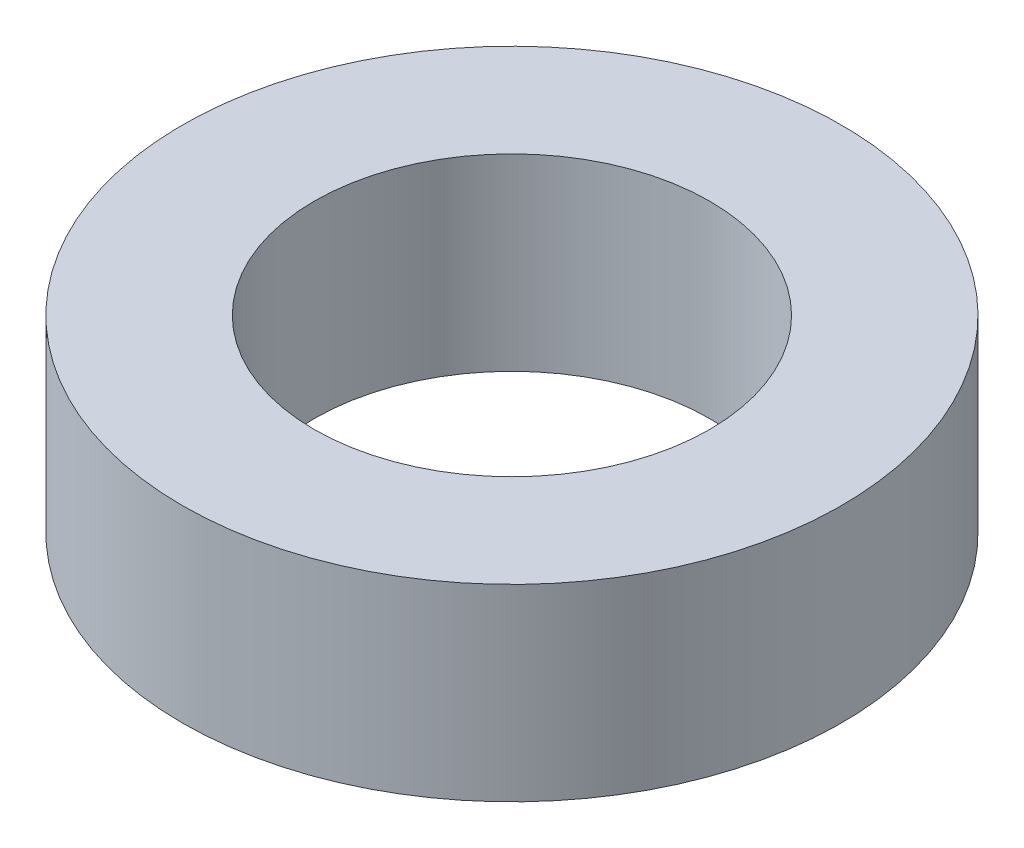
ISO-10303-21;
HEADER;
FILE_DESCRIPTION(('STEP AP214'),'2;1');
FILE_NAME('part.step','',(''),(''),'','','');
FILE_SCHEMA(('AUTOMOTIVE_DESIGN { 1 0 10303 214 1 1 1 1 }'));
ENDSEC;
DATA;
#1=APPLICATION_CONTEXT('core data for automotive mechanical design processes');
#2=APPLICATION_PROTOCOL_DEFINITION('international standard','automotive_design',2000,#1);
#3=PRODUCT_CONTEXT('',#1,'mechanical');
#4=PRODUCT('Part','Part','',(#3));
#5=PRODUCT_RELATED_PRODUCT_CATEGORY('part','',(#4));
#6=PRODUCT_DEFINITION_FORMATION('','',#4);
#7=PRODUCT_DEFINITION_CONTEXT('part definition',#1,'design');
#8=PRODUCT_DEFINITION('design','',#6,#7);
#9=PRODUCT_DEFINITION_SHAPE('','',#8);
#10=(LENGTH_UNIT() NAMED_UNIT(*) SI_UNIT(.MILLI.,.METRE.));
#11=(NAMED_UNIT(*) PLANE_ANGLE_UNIT() SI_UNIT($,.RADIAN.));
#12=(NAMED_UNIT(*) SI_UNIT($,.STERADIAN.) SOLID_ANGLE_UNIT());
#13=UNCERTAINTY_MEASURE_WITH_UNIT(LENGTH_MEASURE(1.E-05),#10,'distance_accuracy_value','');
#14=(GEOMETRIC_REPRESENTATION_CONTEXT(3) GLOBAL_UNCERTAINTY_ASSIGNED_CONTEXT((#13)) GLOBAL_UNIT_ASSIGNED_CONTEXT((#10,
#11,#12)) REPRESENTATION_CONTEXT('',''));
#15=CARTESIAN_POINT('',(0.,0.,0.));
#16=DIRECTION('',(0.,0.,1.));
#17=DIRECTION('',(1.,0.,0.));
#18=AXIS2_PLACEMENT_3D('',#15,#16,#17);
#19=CARTESIAN_POINT('',(0.,2.,0.));
#20=DIRECTION('',(0.,1.,0.));
#21=DIRECTION('',(0.,0.,1.));
#22=AXIS2_PLACEMENT_3D('',#19,#20,#21);
#23=PLANE('',#22);
#24=CARTESIAN_POINT('',(0.,2.,0.));
#25=DIRECTION('',(0.,1.,0.));
#26=DIRECTION('',(0.,0.,1.));
#27=AXIS2_PLACEMENT_3D('',#24,#25,#26);
#28=CIRCLE('',#27,3.5);
#29=CARTESIAN_POINT('',(0.,2.,3.5));
#30=VERTEX_POINT('',#29);
#31=EDGE_CURVE('E10',#30,#30,#28,.T.);
#32=ORIENTED_EDGE('',*,*,#31,.T.);
#33=EDGE_LOOP('',(#32));
#34=FACE_BOUND('',#33,.T.);
#35=CARTESIAN_POINT('',(0.,2.,0.));
#36=DIRECTION('',(0.,1.,0.));
#37=DIRECTION('',(0.,0.,1.));
#38=AXIS2_PLACEMENT_3D('',#35,#36,#37);
#39=CIRCLE('',#38,2.1);
#40=CARTESIAN_POINT('',(0.,2.,2.1));
#41=VERTEX_POINT('',#40);
#42=EDGE_CURVE('E42',#41,#41,#39,.T.);
#43=ORIENTED_EDGE('',*,*,#42,.F.);
#44=EDGE_LOOP('',(#43));
#45=FACE_BOUND('',#44,.T.);
#46=ADVANCED_FACE('F31',(#34,#45),#23,.T.);
#47=CARTESIAN_POINT('',(0.,0.,0.));
#48=DIRECTION('',(0.,1.,0.));
#49=DIRECTION('',(0.,0.,1.));
#50=AXIS2_PLACEMENT_3D('',#47,#48,#49);
#51=PLANE('',#50);
#52=CARTESIAN_POINT('',(0.,0.,0.));
#53=DIRECTION('',(0.,1.,0.));
#54=DIRECTION('',(0.,0.,1.));
#55=AXIS2_PLACEMENT_3D('',#52,#53,#54);
#56=CIRCLE('',#55,3.5);
#57=CARTESIAN_POINT('',(0.,0.,3.5));
#58=VERTEX_POINT('',#57);
#59=EDGE_CURVE('E35',#58,#58,#56,.T.);
#60=ORIENTED_EDGE('',*,*,#59,.F.);
#61=EDGE_LOOP('',(#60));
#62=FACE_BOUND('',#61,.T.);
#63=CARTESIAN_POINT('',(0.,0.,0.));
#64=DIRECTION('',(0.,1.,0.));
#65=DIRECTION('',(0.,0.,1.));
#66=AXIS2_PLACEMENT_3D('',#63,#64,#65);
#67=CIRCLE('',#66,2.1);
#68=CARTESIAN_POINT('',(0.,0.,2.1));
#69=VERTEX_POINT('',#68);
#70=EDGE_CURVE('E44',#69,#69,#67,.T.);
#71=ORIENTED_EDGE('',*,*,#70,.T.);
#72=EDGE_LOOP('',(#71));
#73=FACE_BOUND('',#72,.T.);
#74=ADVANCED_FACE('F54',(#62,#73),#51,.F.);
#75=CARTESIAN_POINT('',(0.,2.,0.));
#76=DIRECTION('',(0.,-1.,0.));
#77=DIRECTION('',(0.,0.,-1.));
#78=AXIS2_PLACEMENT_3D('',#75,#76,#77);
#79=CYLINDRICAL_SURFACE('',#78,3.5);
#80=ORIENTED_EDGE('',*,*,#31,.F.);
#81=EDGE_LOOP('',(#80));
#82=FACE_BOUND('',#81,.T.);
#83=ORIENTED_EDGE('',*,*,#59,.T.);
#84=EDGE_LOOP('',(#83));
#85=FACE_BOUND('',#84,.T.);
#86=ADVANCED_FACE('F33',(#82,#85),#79,.T.);
#87=CARTESIAN_POINT('',(0.,2.,0.));
#88=DIRECTION('',(0.,-1.,0.));
#89=DIRECTION('',(0.,0.,-1.));
#90=AXIS2_PLACEMENT_3D('',#87,#88,#89);
#91=CYLINDRICAL_SURFACE('',#90,2.1);
#92=ORIENTED_EDGE('',*,*,#42,.T.);
#93=EDGE_LOOP('',(#92));
#94=FACE_BOUND('',#93,.T.);
#95=ORIENTED_EDGE('',*,*,#70,.F.);
#96=EDGE_LOOP('',(#95));
#97=FACE_BOUND('',#96,.T.);
#98=ADVANCED_FACE('F50',(#94,#97),#91,.F.);
#99=CLOSED_SHELL('',(#46,#74,#86,#98));
#100=MANIFOLD_SOLID_BREP('B2',#99);
#101=ADVANCED_BREP_SHAPE_REPRESENTATION('',(#18,#100),#14);
#102=SHAPE_DEFINITION_REPRESENTATION(#9,#101);
ENDSEC;
END-ISO-10303-21;
